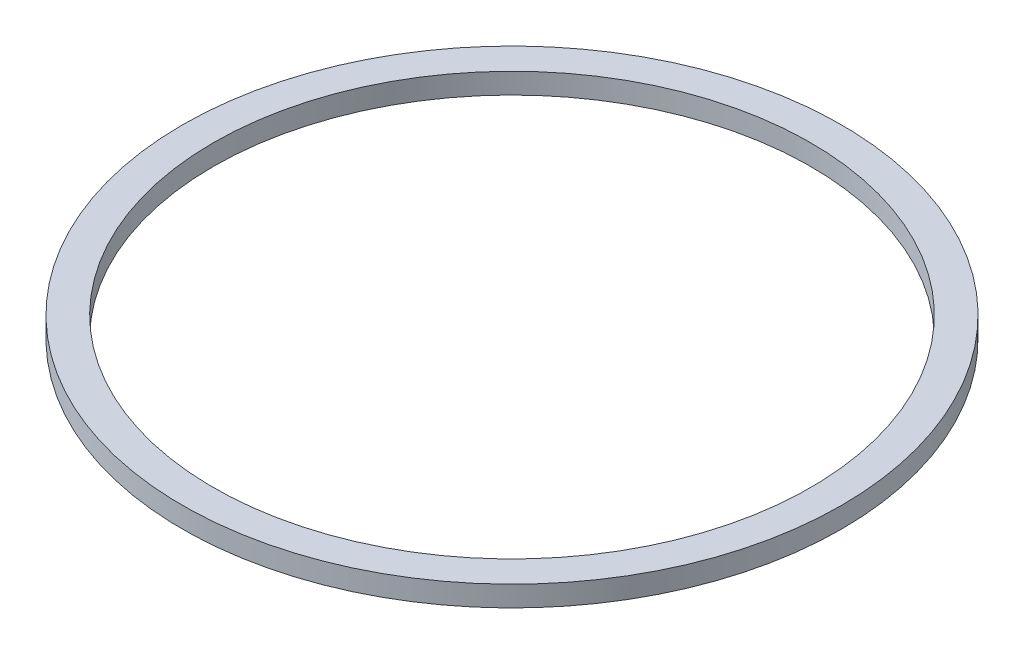
ISO-10303-21;
HEADER;
FILE_DESCRIPTION(('STEP AP214'),'2;1');
FILE_NAME('part.step','',(''),(''),'','','');
FILE_SCHEMA(('AUTOMOTIVE_DESIGN { 1 0 10303 214 1 1 1 1 }'));
ENDSEC;
DATA;
#1=APPLICATION_CONTEXT('core data for automotive mechanical design processes');
#2=APPLICATION_PROTOCOL_DEFINITION('international standard','automotive_design',2000,#1);
#3=PRODUCT_CONTEXT('',#1,'mechanical');
#4=PRODUCT('Part','Part','',(#3));
#5=PRODUCT_RELATED_PRODUCT_CATEGORY('part','',(#4));
#6=PRODUCT_DEFINITION_FORMATION('','',#4);
#7=PRODUCT_DEFINITION_CONTEXT('part definition',#1,'design');
#8=PRODUCT_DEFINITION('design','',#6,#7);
#9=PRODUCT_DEFINITION_SHAPE('','',#8);
#10=(LENGTH_UNIT() NAMED_UNIT(*) SI_UNIT(.MILLI.,.METRE.));
#11=(NAMED_UNIT(*) PLANE_ANGLE_UNIT() SI_UNIT($,.RADIAN.));
#12=(NAMED_UNIT(*) SI_UNIT($,.STERADIAN.) SOLID_ANGLE_UNIT());
#13=UNCERTAINTY_MEASURE_WITH_UNIT(LENGTH_MEASURE(1.E-05),#10,'distance_accuracy_value','');
#14=(GEOMETRIC_REPRESENTATION_CONTEXT(3) GLOBAL_UNCERTAINTY_ASSIGNED_CONTEXT((#13)) GLOBAL_UNIT_ASSIGNED_CONTEXT((#10,
#11,#12)) REPRESENTATION_CONTEXT('',''));
#15=CARTESIAN_POINT('',(0.,0.,0.));
#16=DIRECTION('',(0.,0.,1.));
#17=DIRECTION('',(1.,0.,0.));
#18=AXIS2_PLACEMENT_3D('',#15,#16,#17);
#19=CARTESIAN_POINT('',(0.,0.,0.));
#20=DIRECTION('',(0.,1.,0.));
#21=DIRECTION('',(1.,0.,0.));
#22=AXIS2_PLACEMENT_3D('',#19,#20,#21);
#23=PLANE('',#22);
#24=CARTESIAN_POINT('',(0.,0.,0.));
#25=DIRECTION('',(0.,-1.,0.));
#26=DIRECTION('',(1.,0.,0.));
#27=AXIS2_PLACEMENT_3D('',#24,#25,#26);
#28=CIRCLE('',#27,7.25);
#29=CARTESIAN_POINT('',(-7.25,0.,0.));
#30=VERTEX_POINT('',#29);
#31=EDGE_CURVE('E54',#30,#30,#28,.T.);
#32=ORIENTED_EDGE('',*,*,#31,.F.);
#33=EDGE_LOOP('',(#32));
#34=FACE_BOUND('',#33,.T.);
#35=CARTESIAN_POINT('',(0.,0.,0.));
#36=DIRECTION('',(0.,1.,0.));
#37=DIRECTION('',(-1.,0.,0.));
#38=AXIS2_PLACEMENT_3D('',#35,#36,#37);
#39=CIRCLE('',#38,8.);
#40=CARTESIAN_POINT('',(8.,0.,0.));
#41=VERTEX_POINT('',#40);
#42=EDGE_CURVE('E11',#41,#41,#39,.T.);
#43=ORIENTED_EDGE('',*,*,#42,.F.);
#44=EDGE_LOOP('',(#43));
#45=FACE_BOUND('',#44,.T.);
#46=ADVANCED_FACE('F17',(#34,#45),#23,.F.);
#47=CARTESIAN_POINT('',(0.,0.5,0.));
#48=DIRECTION('',(0.,1.,0.));
#49=DIRECTION('',(1.,0.,0.));
#50=AXIS2_PLACEMENT_3D('',#47,#48,#49);
#51=PLANE('',#50);
#52=CARTESIAN_POINT('',(0.,0.5,0.));
#53=DIRECTION('',(0.,-1.,0.));
#54=DIRECTION('',(1.,0.,0.));
#55=AXIS2_PLACEMENT_3D('',#52,#53,#54);
#56=CIRCLE('',#55,7.25);
#57=CARTESIAN_POINT('',(-7.25,0.5,0.));
#58=VERTEX_POINT('',#57);
#59=EDGE_CURVE('E52',#58,#58,#56,.T.);
#60=ORIENTED_EDGE('',*,*,#59,.T.);
#61=EDGE_LOOP('',(#60));
#62=FACE_BOUND('',#61,.T.);
#63=CARTESIAN_POINT('',(0.,0.5,0.));
#64=DIRECTION('',(0.,1.,0.));
#65=DIRECTION('',(-1.,0.,0.));
#66=AXIS2_PLACEMENT_3D('',#63,#64,#65);
#67=CIRCLE('',#66,8.);
#68=CARTESIAN_POINT('',(8.,0.5,0.));
#69=VERTEX_POINT('',#68);
#70=EDGE_CURVE('E65',#69,#69,#67,.T.);
#71=ORIENTED_EDGE('',*,*,#70,.T.);
#72=EDGE_LOOP('',(#71));
#73=FACE_BOUND('',#72,.T.);
#74=ADVANCED_FACE('F19',(#62,#73),#51,.T.);
#75=CARTESIAN_POINT('',(0.,0.,0.));
#76=DIRECTION('',(0.,1.,0.));
#77=DIRECTION('',(-1.,0.,0.));
#78=AXIS2_PLACEMENT_3D('',#75,#76,#77);
#79=CYLINDRICAL_SURFACE('',#78,8.);
#80=ORIENTED_EDGE('',*,*,#70,.F.);
#81=DIRECTION('',(0.,-1.,0.));
#82=VECTOR('',#81,1.);
#83=CARTESIAN_POINT('',(8.,0.,0.));
#84=LINE('',#83,#82);
#85=EDGE_CURVE('E27',#69,#41,#84,.T.);
#86=ORIENTED_EDGE('',*,*,#85,.T.);
#87=ORIENTED_EDGE('',*,*,#42,.T.);
#88=ORIENTED_EDGE('',*,*,#85,.F.);
#89=EDGE_LOOP('',(#80,#86,#87,#88));
#90=FACE_BOUND('',#89,.T.);
#91=ADVANCED_FACE('F102',(#90),#79,.T.);
#92=CARTESIAN_POINT('',(0.,0.,0.));
#93=DIRECTION('',(0.,1.,0.));
#94=DIRECTION('',(1.,0.,0.));
#95=AXIS2_PLACEMENT_3D('',#92,#93,#94);
#96=CYLINDRICAL_SURFACE('',#95,7.25);
#97=ORIENTED_EDGE('',*,*,#59,.F.);
#98=DIRECTION('',(0.,-1.,0.));
#99=VECTOR('',#98,1.);
#100=CARTESIAN_POINT('',(-7.25,0.,0.));
#101=LINE('',#100,#99);
#102=EDGE_CURVE('E49',#58,#30,#101,.T.);
#103=ORIENTED_EDGE('',*,*,#102,.T.);
#104=ORIENTED_EDGE('',*,*,#31,.T.);
#105=ORIENTED_EDGE('',*,*,#102,.F.);
#106=EDGE_LOOP('',(#97,#103,#104,#105));
#107=FACE_BOUND('',#106,.T.);
#108=ADVANCED_FACE('F51',(#107),#96,.F.);
#109=CLOSED_SHELL('',(#46,#74,#91,#108));
#110=MANIFOLD_SOLID_BREP('B1',#109);
#111=ADVANCED_BREP_SHAPE_REPRESENTATION('',(#18,#110),#14);
#112=SHAPE_DEFINITION_REPRESENTATION(#9,#111);
ENDSEC;
END-ISO-10303-21;
